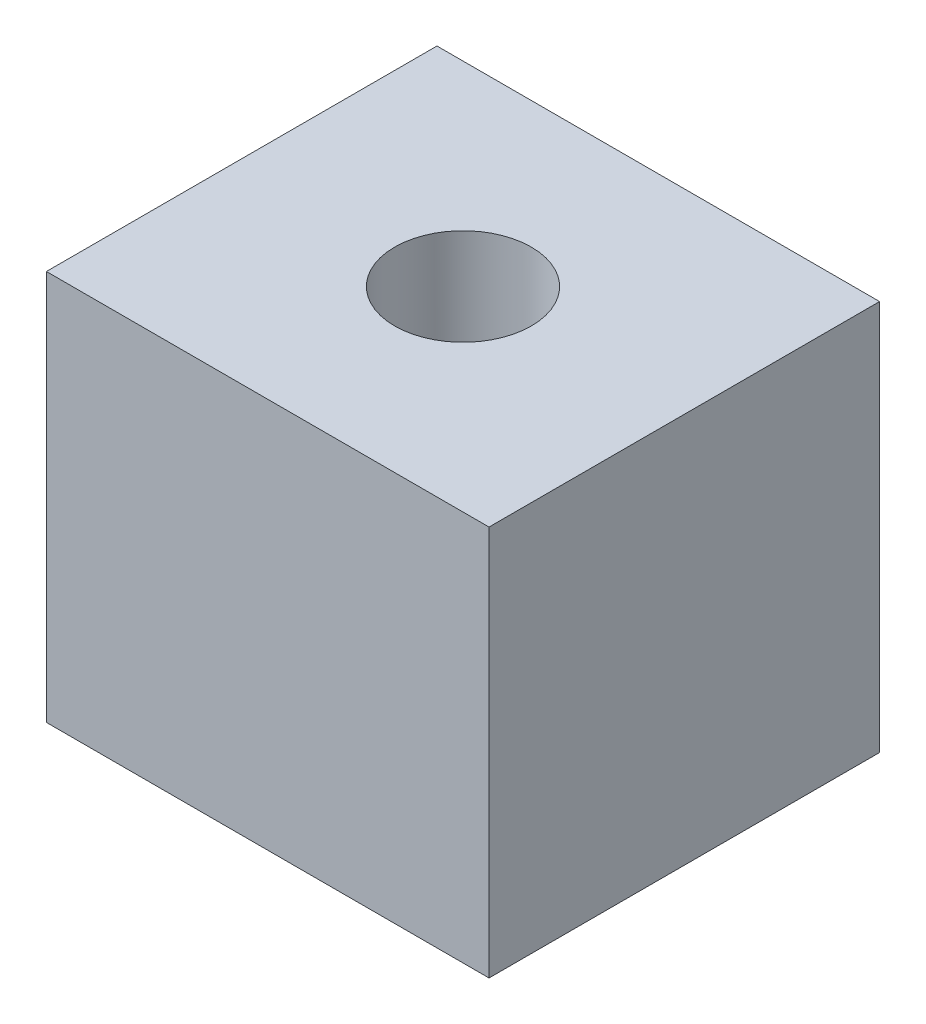
ISO-10303-21;
HEADER;
FILE_DESCRIPTION(('STEP AP214'),'2;1');
FILE_NAME('part.step','',(''),(''),'','','');
FILE_SCHEMA(('AUTOMOTIVE_DESIGN { 1 0 10303 214 1 1 1 1 }'));
ENDSEC;
DATA;
#1=APPLICATION_CONTEXT('core data for automotive mechanical design processes');
#2=APPLICATION_PROTOCOL_DEFINITION('international standard','automotive_design',2000,#1);
#3=PRODUCT_CONTEXT('',#1,'mechanical');
#4=PRODUCT('Part','Part','',(#3));
#5=PRODUCT_RELATED_PRODUCT_CATEGORY('part','',(#4));
#6=PRODUCT_DEFINITION_FORMATION('','',#4);
#7=PRODUCT_DEFINITION_CONTEXT('part definition',#1,'design');
#8=PRODUCT_DEFINITION('design','',#6,#7);
#9=PRODUCT_DEFINITION_SHAPE('','',#8);
#10=(LENGTH_UNIT() NAMED_UNIT(*) SI_UNIT(.MILLI.,.METRE.));
#11=(NAMED_UNIT(*) PLANE_ANGLE_UNIT() SI_UNIT($,.RADIAN.));
#12=(NAMED_UNIT(*) SI_UNIT($,.STERADIAN.) SOLID_ANGLE_UNIT());
#13=UNCERTAINTY_MEASURE_WITH_UNIT(LENGTH_MEASURE(1.E-05),#10,'distance_accuracy_value','');
#14=(GEOMETRIC_REPRESENTATION_CONTEXT(3) GLOBAL_UNCERTAINTY_ASSIGNED_CONTEXT((#13)) GLOBAL_UNIT_ASSIGNED_CONTEXT((#10,
#11,#12)) REPRESENTATION_CONTEXT('',''));
#15=CARTESIAN_POINT('',(0.,0.,0.));
#16=DIRECTION('',(0.,0.,1.));
#17=DIRECTION('',(1.,0.,0.));
#18=AXIS2_PLACEMENT_3D('',#15,#16,#17);
#19=CARTESIAN_POINT('',(0.,0.,30.));
#20=DIRECTION('',(1.,0.,0.));
#21=DIRECTION('',(0.,0.,-1.));
#22=AXIS2_PLACEMENT_3D('',#19,#20,#21);
#23=PLANE('',#22);
#24=DIRECTION('',(0.,-1.,0.));
#25=VECTOR('',#24,1.);
#26=CARTESIAN_POINT('',(0.,0.,0.));
#27=LINE('',#26,#25);
#28=CARTESIAN_POINT('',(0.,30.,0.));
#29=VERTEX_POINT('',#28);
#30=CARTESIAN_POINT('',(0.,0.,0.));
#31=VERTEX_POINT('',#30);
#32=EDGE_CURVE('E108',#29,#31,#27,.T.);
#33=ORIENTED_EDGE('',*,*,#32,.T.);
#34=DIRECTION('',(0.,0.,-1.));
#35=VECTOR('',#34,1.);
#36=CARTESIAN_POINT('',(0.,0.,30.));
#37=LINE('',#36,#35);
#38=CARTESIAN_POINT('',(0.,0.,30.));
#39=VERTEX_POINT('',#38);
#40=EDGE_CURVE('E11',#39,#31,#37,.T.);
#41=ORIENTED_EDGE('',*,*,#40,.F.);
#42=DIRECTION('',(0.,-1.,0.));
#43=VECTOR('',#42,1.);
#44=CARTESIAN_POINT('',(0.,0.,30.));
#45=LINE('',#44,#43);
#46=CARTESIAN_POINT('',(0.,30.,30.));
#47=VERTEX_POINT('',#46);
#48=EDGE_CURVE('E91',#47,#39,#45,.T.);
#49=ORIENTED_EDGE('',*,*,#48,.F.);
#50=DIRECTION('',(0.,0.,-1.));
#51=VECTOR('',#50,1.);
#52=CARTESIAN_POINT('',(0.,30.,30.));
#53=LINE('',#52,#51);
#54=EDGE_CURVE('E104',#47,#29,#53,.T.);
#55=ORIENTED_EDGE('',*,*,#54,.T.);
#56=EDGE_LOOP('',(#33,#41,#49,#55));
#57=FACE_BOUND('',#56,.T.);
#58=ADVANCED_FACE('F38',(#57),#23,.F.);
#59=CARTESIAN_POINT('',(0.,0.,30.));
#60=DIRECTION('',(0.,1.,0.));
#61=DIRECTION('',(0.,0.,1.));
#62=AXIS2_PLACEMENT_3D('',#59,#60,#61);
#63=PLANE('',#62);
#64=CARTESIAN_POINT('',(17.,0.,15.));
#65=DIRECTION('',(0.,1.,0.));
#66=DIRECTION('',(0.,0.,1.));
#67=AXIS2_PLACEMENT_3D('',#64,#65,#66);
#68=CIRCLE('',#67,5.25);
#69=CARTESIAN_POINT('',(17.,0.,20.25));
#70=VERTEX_POINT('',#69);
#71=EDGE_CURVE('E128',#70,#70,#68,.T.);
#72=ORIENTED_EDGE('',*,*,#71,.T.);
#73=EDGE_LOOP('',(#72));
#74=FACE_BOUND('',#73,.T.);
#75=DIRECTION('',(1.,0.,0.));
#76=VECTOR('',#75,1.);
#77=CARTESIAN_POINT('',(0.,0.,0.));
#78=LINE('',#77,#76);
#79=CARTESIAN_POINT('',(34.,0.,0.));
#80=VERTEX_POINT('',#79);
#81=EDGE_CURVE('E96',#31,#80,#78,.T.);
#82=ORIENTED_EDGE('',*,*,#81,.T.);
#83=DIRECTION('',(0.,0.,-1.));
#84=VECTOR('',#83,1.);
#85=CARTESIAN_POINT('',(34.,0.,30.));
#86=LINE('',#85,#84);
#87=CARTESIAN_POINT('',(34.,0.,30.));
#88=VERTEX_POINT('',#87);
#89=EDGE_CURVE('E48',#88,#80,#86,.T.);
#90=ORIENTED_EDGE('',*,*,#89,.F.);
#91=DIRECTION('',(1.,0.,0.));
#92=VECTOR('',#91,1.);
#93=CARTESIAN_POINT('',(0.,0.,30.));
#94=LINE('',#93,#92);
#95=EDGE_CURVE('E86',#39,#88,#94,.T.);
#96=ORIENTED_EDGE('',*,*,#95,.F.);
#97=ORIENTED_EDGE('',*,*,#40,.T.);
#98=EDGE_LOOP('',(#82,#90,#96,#97));
#99=FACE_BOUND('',#98,.T.);
#100=ADVANCED_FACE('F95',(#74,#99),#63,.F.);
#101=CARTESIAN_POINT('',(34.,0.,30.));
#102=DIRECTION('',(-1.,0.,0.));
#103=DIRECTION('',(0.,0.,1.));
#104=AXIS2_PLACEMENT_3D('',#101,#102,#103);
#105=PLANE('',#104);
#106=DIRECTION('',(0.,1.,0.));
#107=VECTOR('',#106,1.);
#108=CARTESIAN_POINT('',(34.,0.,0.));
#109=LINE('',#108,#107);
#110=CARTESIAN_POINT('',(34.,30.,0.));
#111=VERTEX_POINT('',#110);
#112=EDGE_CURVE('E73',#80,#111,#109,.T.);
#113=ORIENTED_EDGE('',*,*,#112,.T.);
#114=DIRECTION('',(0.,0.,-1.));
#115=VECTOR('',#114,1.);
#116=CARTESIAN_POINT('',(34.,30.,30.));
#117=LINE('',#116,#115);
#118=CARTESIAN_POINT('',(34.,30.,30.));
#119=VERTEX_POINT('',#118);
#120=EDGE_CURVE('E98',#119,#111,#117,.T.);
#121=ORIENTED_EDGE('',*,*,#120,.F.);
#122=DIRECTION('',(0.,1.,0.));
#123=VECTOR('',#122,1.);
#124=CARTESIAN_POINT('',(34.,0.,30.));
#125=LINE('',#124,#123);
#126=EDGE_CURVE('E89',#88,#119,#125,.T.);
#127=ORIENTED_EDGE('',*,*,#126,.F.);
#128=ORIENTED_EDGE('',*,*,#89,.T.);
#129=EDGE_LOOP('',(#113,#121,#127,#128));
#130=FACE_BOUND('',#129,.T.);
#131=ADVANCED_FACE('F100',(#130),#105,.F.);
#132=CARTESIAN_POINT('',(0.,30.,30.));
#133=DIRECTION('',(0.,-1.,0.));
#134=DIRECTION('',(0.,0.,-1.));
#135=AXIS2_PLACEMENT_3D('',#132,#133,#134);
#136=PLANE('',#135);
#137=CARTESIAN_POINT('',(17.,30.,15.));
#138=DIRECTION('',(0.,-1.,0.));
#139=DIRECTION('',(0.,0.,-1.));
#140=AXIS2_PLACEMENT_3D('',#137,#138,#139);
#141=CIRCLE('',#140,5.25);
#142=CARTESIAN_POINT('',(17.,30.,9.75));
#143=VERTEX_POINT('',#142);
#144=EDGE_CURVE('E41',#143,#143,#141,.T.);
#145=ORIENTED_EDGE('',*,*,#144,.T.);
#146=EDGE_LOOP('',(#145));
#147=FACE_BOUND('',#146,.T.);
#148=DIRECTION('',(-1.,0.,0.));
#149=VECTOR('',#148,1.);
#150=CARTESIAN_POINT('',(0.,30.,0.));
#151=LINE('',#150,#149);
#152=EDGE_CURVE('E79',#111,#29,#151,.T.);
#153=ORIENTED_EDGE('',*,*,#152,.T.);
#154=ORIENTED_EDGE('',*,*,#54,.F.);
#155=DIRECTION('',(-1.,0.,0.));
#156=VECTOR('',#155,1.);
#157=CARTESIAN_POINT('',(0.,30.,30.));
#158=LINE('',#157,#156);
#159=EDGE_CURVE('E56',#119,#47,#158,.T.);
#160=ORIENTED_EDGE('',*,*,#159,.F.);
#161=ORIENTED_EDGE('',*,*,#120,.T.);
#162=EDGE_LOOP('',(#153,#154,#160,#161));
#163=FACE_BOUND('',#162,.T.);
#164=ADVANCED_FACE('F121',(#147,#163),#136,.F.);
#165=CARTESIAN_POINT('',(0.,0.,30.));
#166=DIRECTION('',(0.,0.,-1.));
#167=DIRECTION('',(-1.,0.,0.));
#168=AXIS2_PLACEMENT_3D('',#165,#166,#167);
#169=PLANE('',#168);
#170=ORIENTED_EDGE('',*,*,#48,.T.);
#171=ORIENTED_EDGE('',*,*,#95,.T.);
#172=ORIENTED_EDGE('',*,*,#126,.T.);
#173=ORIENTED_EDGE('',*,*,#159,.T.);
#174=EDGE_LOOP('',(#170,#171,#172,#173));
#175=FACE_BOUND('',#174,.T.);
#176=ADVANCED_FACE('F87',(#175),#169,.F.);
#177=CARTESIAN_POINT('',(0.,0.,0.));
#178=DIRECTION('',(0.,0.,-1.));
#179=DIRECTION('',(-1.,0.,0.));
#180=AXIS2_PLACEMENT_3D('',#177,#178,#179);
#181=PLANE('',#180);
#182=CARTESIAN_POINT('',(5.,25.,0.));
#183=DIRECTION('',(0.,0.,-1.));
#184=DIRECTION('',(1.,0.,0.));
#185=AXIS2_PLACEMENT_3D('',#182,#183,#184);
#186=CIRCLE('',#185,1.7);
#187=CARTESIAN_POINT('',(6.7,25.,0.));
#188=VERTEX_POINT('',#187);
#189=EDGE_CURVE('E141',#188,#188,#186,.T.);
#190=ORIENTED_EDGE('',*,*,#189,.F.);
#191=EDGE_LOOP('',(#190));
#192=FACE_BOUND('',#191,.T.);
#193=CARTESIAN_POINT('',(5.,5.,0.));
#194=DIRECTION('',(0.,0.,-1.));
#195=DIRECTION('',(-1.,0.,0.));
#196=AXIS2_PLACEMENT_3D('',#193,#194,#195);
#197=CIRCLE('',#196,1.7);
#198=CARTESIAN_POINT('',(3.3,5.,0.));
#199=VERTEX_POINT('',#198);
#200=EDGE_CURVE('E149',#199,#199,#197,.T.);
#201=ORIENTED_EDGE('',*,*,#200,.F.);
#202=EDGE_LOOP('',(#201));
#203=FACE_BOUND('',#202,.T.);
#204=CARTESIAN_POINT('',(29.,5.,0.));
#205=DIRECTION('',(0.,0.,-1.));
#206=DIRECTION('',(1.,0.,0.));
#207=AXIS2_PLACEMENT_3D('',#204,#205,#206);
#208=CIRCLE('',#207,1.7);
#209=CARTESIAN_POINT('',(30.7,5.,0.));
#210=VERTEX_POINT('',#209);
#211=EDGE_CURVE('E157',#210,#210,#208,.T.);
#212=ORIENTED_EDGE('',*,*,#211,.F.);
#213=EDGE_LOOP('',(#212));
#214=FACE_BOUND('',#213,.T.);
#215=CARTESIAN_POINT('',(29.,25.,0.));
#216=DIRECTION('',(0.,0.,-1.));
#217=DIRECTION('',(-1.,0.,0.));
#218=AXIS2_PLACEMENT_3D('',#215,#216,#217);
#219=CIRCLE('',#218,1.7);
#220=CARTESIAN_POINT('',(27.3,25.,0.));
#221=VERTEX_POINT('',#220);
#222=EDGE_CURVE('E133',#221,#221,#219,.T.);
#223=ORIENTED_EDGE('',*,*,#222,.F.);
#224=EDGE_LOOP('',(#223));
#225=FACE_BOUND('',#224,.T.);
#226=ORIENTED_EDGE('',*,*,#32,.F.);
#227=ORIENTED_EDGE('',*,*,#152,.F.);
#228=ORIENTED_EDGE('',*,*,#112,.F.);
#229=ORIENTED_EDGE('',*,*,#81,.F.);
#230=EDGE_LOOP('',(#226,#227,#228,#229));
#231=FACE_BOUND('',#230,.T.);
#232=ADVANCED_FACE('F124',(#192,#203,#214,#225,#231),#181,.T.);
#233=CARTESIAN_POINT('',(17.,0.,15.));
#234=DIRECTION('',(0.,1.,0.));
#235=DIRECTION('',(0.,0.,1.));
#236=AXIS2_PLACEMENT_3D('',#233,#234,#235);
#237=CYLINDRICAL_SURFACE('',#236,5.25);
#238=ORIENTED_EDGE('',*,*,#71,.F.);
#239=EDGE_LOOP('',(#238));
#240=FACE_BOUND('',#239,.T.);
#241=ORIENTED_EDGE('',*,*,#144,.F.);
#242=EDGE_LOOP('',(#241));
#243=FACE_BOUND('',#242,.T.);
#244=ADVANCED_FACE('F176',(#240,#243),#237,.F.);
#245=CARTESIAN_POINT('',(29.,25.,4.));
#246=DIRECTION('',(0.,0.,-1.));
#247=DIRECTION('',(-1.,0.,0.));
#248=AXIS2_PLACEMENT_3D('',#245,#246,#247);
#249=CYLINDRICAL_SURFACE('',#248,1.7);
#250=CARTESIAN_POINT('',(29.,25.,4.));
#251=DIRECTION('',(0.,0.,-1.));
#252=DIRECTION('',(-1.,0.,0.));
#253=AXIS2_PLACEMENT_3D('',#250,#251,#252);
#254=CIRCLE('',#253,1.7);
#255=CARTESIAN_POINT('',(27.3,25.,4.));
#256=VERTEX_POINT('',#255);
#257=EDGE_CURVE('E132',#256,#256,#254,.T.);
#258=ORIENTED_EDGE('',*,*,#257,.F.);
#259=EDGE_LOOP('',(#258));
#260=FACE_BOUND('',#259,.T.);
#261=ORIENTED_EDGE('',*,*,#222,.T.);
#262=EDGE_LOOP('',(#261));
#263=FACE_BOUND('',#262,.T.);
#264=ADVANCED_FACE('F181',(#260,#263),#249,.F.);
#265=CARTESIAN_POINT('',(29.,25.,4.));
#266=DIRECTION('',(0.,0.,-1.));
#267=DIRECTION('',(-1.,0.,0.));
#268=AXIS2_PLACEMENT_3D('',#265,#266,#267);
#269=PLANE('',#268);
#270=ORIENTED_EDGE('',*,*,#257,.T.);
#271=EDGE_LOOP('',(#270));
#272=FACE_BOUND('',#271,.T.);
#273=ADVANCED_FACE('F170',(#272),#269,.T.);
#274=CARTESIAN_POINT('',(29.,5.,4.));
#275=DIRECTION('',(0.,0.,-1.));
#276=DIRECTION('',(-1.,0.,0.));
#277=AXIS2_PLACEMENT_3D('',#274,#275,#276);
#278=CYLINDRICAL_SURFACE('',#277,1.7);
#279=CARTESIAN_POINT('',(29.,5.,4.));
#280=DIRECTION('',(0.,0.,-1.));
#281=DIRECTION('',(1.,0.,0.));
#282=AXIS2_PLACEMENT_3D('',#279,#280,#281);
#283=CIRCLE('',#282,1.7);
#284=CARTESIAN_POINT('',(30.7,5.,4.));
#285=VERTEX_POINT('',#284);
#286=EDGE_CURVE('E137',#285,#285,#283,.T.);
#287=ORIENTED_EDGE('',*,*,#286,.F.);
#288=EDGE_LOOP('',(#287));
#289=FACE_BOUND('',#288,.T.);
#290=ORIENTED_EDGE('',*,*,#211,.T.);
#291=EDGE_LOOP('',(#290));
#292=FACE_BOUND('',#291,.T.);
#293=ADVANCED_FACE('F167',(#289,#292),#278,.F.);
#294=CARTESIAN_POINT('',(29.,5.,4.));
#295=DIRECTION('',(0.,0.,1.));
#296=DIRECTION('',(1.,0.,0.));
#297=AXIS2_PLACEMENT_3D('',#294,#295,#296);
#298=PLANE('',#297);
#299=ORIENTED_EDGE('',*,*,#286,.T.);
#300=EDGE_LOOP('',(#299));
#301=FACE_BOUND('',#300,.T.);
#302=ADVANCED_FACE('F165',(#301),#298,.F.);
#303=CARTESIAN_POINT('',(5.,5.,4.));
#304=DIRECTION('',(0.,0.,-1.));
#305=DIRECTION('',(-1.,0.,0.));
#306=AXIS2_PLACEMENT_3D('',#303,#304,#305);
#307=CYLINDRICAL_SURFACE('',#306,1.7);
#308=CARTESIAN_POINT('',(5.,5.,4.));
#309=DIRECTION('',(0.,0.,-1.));
#310=DIRECTION('',(-1.,0.,0.));
#311=AXIS2_PLACEMENT_3D('',#308,#309,#310);
#312=CIRCLE('',#311,1.7);
#313=CARTESIAN_POINT('',(3.3,5.,4.));
#314=VERTEX_POINT('',#313);
#315=EDGE_CURVE('E153',#314,#314,#312,.T.);
#316=ORIENTED_EDGE('',*,*,#315,.F.);
#317=EDGE_LOOP('',(#316));
#318=FACE_BOUND('',#317,.T.);
#319=ORIENTED_EDGE('',*,*,#200,.T.);
#320=EDGE_LOOP('',(#319));
#321=FACE_BOUND('',#320,.T.);
#322=ADVANCED_FACE('F249',(#318,#321),#307,.F.);
#323=CARTESIAN_POINT('',(5.,5.,4.));
#324=DIRECTION('',(0.,0.,-1.));
#325=DIRECTION('',(-1.,0.,0.));
#326=AXIS2_PLACEMENT_3D('',#323,#324,#325);
#327=PLANE('',#326);
#328=ORIENTED_EDGE('',*,*,#315,.T.);
#329=EDGE_LOOP('',(#328));
#330=FACE_BOUND('',#329,.T.);
#331=ADVANCED_FACE('F257',(#330),#327,.T.);
#332=CARTESIAN_POINT('',(5.,25.,4.));
#333=DIRECTION('',(0.,0.,-1.));
#334=DIRECTION('',(-1.,0.,0.));
#335=AXIS2_PLACEMENT_3D('',#332,#333,#334);
#336=CYLINDRICAL_SURFACE('',#335,1.7);
#337=CARTESIAN_POINT('',(5.,25.,4.));
#338=DIRECTION('',(0.,0.,-1.));
#339=DIRECTION('',(1.,0.,0.));
#340=AXIS2_PLACEMENT_3D('',#337,#338,#339);
#341=CIRCLE('',#340,1.7);
#342=CARTESIAN_POINT('',(6.7,25.,4.));
#343=VERTEX_POINT('',#342);
#344=EDGE_CURVE('E145',#343,#343,#341,.T.);
#345=ORIENTED_EDGE('',*,*,#344,.F.);
#346=EDGE_LOOP('',(#345));
#347=FACE_BOUND('',#346,.T.);
#348=ORIENTED_EDGE('',*,*,#189,.T.);
#349=EDGE_LOOP('',(#348));
#350=FACE_BOUND('',#349,.T.);
#351=ADVANCED_FACE('F266',(#347,#350),#336,.F.);
#352=CARTESIAN_POINT('',(5.,25.,4.));
#353=DIRECTION('',(0.,0.,1.));
#354=DIRECTION('',(1.,0.,0.));
#355=AXIS2_PLACEMENT_3D('',#352,#353,#354);
#356=PLANE('',#355);
#357=ORIENTED_EDGE('',*,*,#344,.T.);
#358=EDGE_LOOP('',(#357));
#359=FACE_BOUND('',#358,.T.);
#360=ADVANCED_FACE('F275',(#359),#356,.F.);
#361=CLOSED_SHELL('',(#58,#100,#131,#164,#176,#232,#244,#264,#273,#293,#302,#322,#331,#351,#360));
#362=MANIFOLD_SOLID_BREP('B2',#361);
#363=ADVANCED_BREP_SHAPE_REPRESENTATION('',(#18,#362),#14);
#364=SHAPE_DEFINITION_REPRESENTATION(#9,#363);
ENDSEC;
END-ISO-10303-21;
